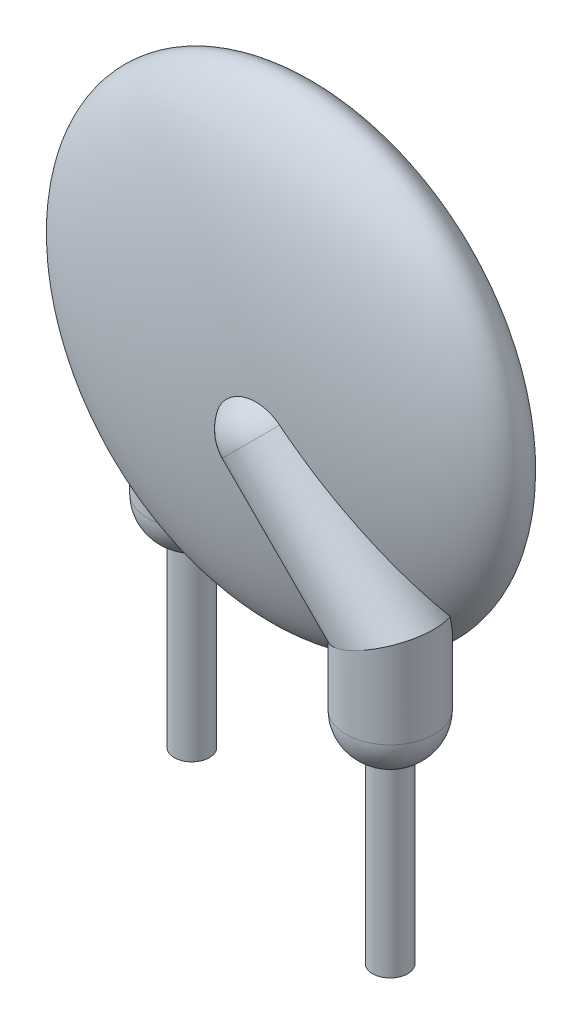
ISO-10303-21;
HEADER;
FILE_DESCRIPTION(('STEP AP214'),'2;1');
FILE_NAME('part.step','',(''),(''),'','','');
FILE_SCHEMA(('AUTOMOTIVE_DESIGN { 1 0 10303 214 1 1 1 1 }'));
ENDSEC;
DATA;
#1=APPLICATION_CONTEXT('core data for automotive mechanical design processes');
#2=APPLICATION_PROTOCOL_DEFINITION('international standard','automotive_design',2000,#1);
#3=PRODUCT_CONTEXT('',#1,'mechanical');
#4=PRODUCT('Part','Part','',(#3));
#5=PRODUCT_RELATED_PRODUCT_CATEGORY('part','',(#4));
#6=PRODUCT_DEFINITION_FORMATION('','',#4);
#7=PRODUCT_DEFINITION_CONTEXT('part definition',#1,'design');
#8=PRODUCT_DEFINITION('design','',#6,#7);
#9=PRODUCT_DEFINITION_SHAPE('','',#8);
#10=(LENGTH_UNIT() NAMED_UNIT(*) SI_UNIT(.MILLI.,.METRE.));
#11=(NAMED_UNIT(*) PLANE_ANGLE_UNIT() SI_UNIT($,.RADIAN.));
#12=(NAMED_UNIT(*) SI_UNIT($,.STERADIAN.) SOLID_ANGLE_UNIT());
#13=UNCERTAINTY_MEASURE_WITH_UNIT(LENGTH_MEASURE(1.E-05),#10,'distance_accuracy_value','');
#14=(GEOMETRIC_REPRESENTATION_CONTEXT(3) GLOBAL_UNCERTAINTY_ASSIGNED_CONTEXT((#13)) GLOBAL_UNIT_ASSIGNED_CONTEXT((#10,
#11,#12)) REPRESENTATION_CONTEXT('',''));
#15=CARTESIAN_POINT('',(0.,0.,0.));
#16=DIRECTION('',(0.,0.,1.));
#17=DIRECTION('',(1.,0.,0.));
#18=AXIS2_PLACEMENT_3D('',#15,#16,#17);
#19=CARTESIAN_POINT('',(2.44,-7.44000000000001,0.75));
#20=DIRECTION('',(0.,-1.,0.));
#21=DIRECTION('',(1.,0.,0.));
#22=AXIS2_PLACEMENT_3D('',#19,#20,#21);
#23=PLANE('',#22);
#24=CARTESIAN_POINT('',(2.44,-7.44000000000001,0.75));
#25=DIRECTION('',(0.,-1.,0.));
#26=DIRECTION('',(1.,0.,0.));
#27=AXIS2_PLACEMENT_3D('',#24,#25,#26);
#28=CIRCLE('',#27,0.3);
#29=CARTESIAN_POINT('',(2.74,-7.44000000000001,0.75));
#30=VERTEX_POINT('',#29);
#31=EDGE_CURVE('E193',#30,#30,#28,.T.);
#32=ORIENTED_EDGE('',*,*,#31,.T.);
#33=EDGE_LOOP('',(#32));
#34=FACE_BOUND('',#33,.T.);
#35=ADVANCED_FACE('F35',(#34),#23,.T.);
#36=CARTESIAN_POINT('',(2.44,-2.20330952441689,0.75));
#37=DIRECTION('',(0.,-1.,0.));
#38=DIRECTION('',(0.,0.,-1.));
#39=AXIS2_PLACEMENT_3D('',#36,#37,#38);
#40=CYLINDRICAL_SURFACE('',#39,0.3);
#41=CARTESIAN_POINT('',(2.44,-4.33585394343971,0.75));
#42=DIRECTION('',(0.,-1.,0.));
#43=DIRECTION('',(1.,0.,0.));
#44=AXIS2_PLACEMENT_3D('',#41,#42,#43);
#45=CIRCLE('',#44,0.3);
#46=CARTESIAN_POINT('',(2.74,-4.33585394343971,0.75));
#47=VERTEX_POINT('',#46);
#48=EDGE_CURVE('E195',#47,#47,#45,.F.);
#49=ORIENTED_EDGE('',*,*,#48,.F.);
#50=EDGE_LOOP('',(#49));
#51=FACE_BOUND('',#50,.T.);
#52=ORIENTED_EDGE('',*,*,#31,.F.);
#53=EDGE_LOOP('',(#52));
#54=FACE_BOUND('',#53,.T.);
#55=ADVANCED_FACE('F157',(#51,#54),#40,.T.);
#56=CARTESIAN_POINT('',(2.44,-1.99827381104221,0.75));
#57=DIRECTION('',(0.,-1.,0.));
#58=DIRECTION('',(1.,0.,0.));
#59=AXIS2_PLACEMENT_3D('',#56,#57,#58);
#60=CYLINDRICAL_SURFACE('',#59,0.75);
#61=CARTESIAN_POINT('',(3.10418976938165,-2.12002375257806,0.401643931804329));
#62=CARTESIAN_POINT('',(3.0987257976857,-2.15087015323609,0.391239018179564));
#63=CARTESIAN_POINT('',(3.09279255312696,-2.18153196072183,0.3805092808965));
#64=CARTESIAN_POINT('',(3.07977664974558,-2.24249755066909,0.358396194446954));
#65=CARTESIAN_POINT('',(3.07269003010087,-2.27279969897731,0.347010683567657));
#66=CARTESIAN_POINT('',(3.05718340473913,-2.33287333694607,0.323642347032431));
#67=CARTESIAN_POINT('',(3.04876189489372,-2.36264418533478,0.311658858150177));
#68=CARTESIAN_POINT('',(3.03039771305174,-2.42142815290459,0.287221707357246));
#69=CARTESIAN_POINT('',(3.02045878913228,-2.45044293832917,0.274769259379491));
#70=CARTESIAN_POINT('',(2.99883830153099,-2.50762541256932,0.249524770596092));
#71=CARTESIAN_POINT('',(2.98715873281078,-2.535794027348,0.23673313215809));
#72=CARTESIAN_POINT('',(2.96185820363817,-2.59116498582171,0.211029827088488));
#73=CARTESIAN_POINT('',(2.94823861021436,-2.61836799320756,0.198118250908807));
#74=CARTESIAN_POINT('',(2.91714995648035,-2.67490499214202,0.170946435290284));
#75=CARTESIAN_POINT('',(2.89941538788338,-2.70410525732029,0.156709376639755));
#76=CARTESIAN_POINT('',(2.86125359311752,-2.76110025822191,0.129032765355938));
#77=CARTESIAN_POINT('',(2.84082603387674,-2.78889481949702,0.11559331166992));
#78=CARTESIAN_POINT('',(2.79746355608369,-2.8430618409199,0.0901899741638724));
#79=CARTESIAN_POINT('',(2.77453416432202,-2.86943725094564,0.0782229573042048));
#80=CARTESIAN_POINT('',(2.72645985319182,-2.92099987968066,0.0563590004024998));
#81=CARTESIAN_POINT('',(2.70131497778452,-2.94618712195121,0.0464620192984518));
#82=CARTESIAN_POINT('',(2.64912482140116,-2.99573328620961,0.0292183475436259));
#83=CARTESIAN_POINT('',(2.6220704172847,-3.02008727235989,0.0218850581589745));
#84=CARTESIAN_POINT('',(2.56665200220072,-3.06803297590493,0.0102285470305269));
#85=CARTESIAN_POINT('',(2.53828762899044,-3.09162447934923,0.00590616326444018));
#86=CARTESIAN_POINT('',(2.48068475405711,-3.13809733154814,0.000545485834153509));
#87=CARTESIAN_POINT('',(2.45144642368398,-3.16097881774039,-0.000493447382086912));
#88=CARTESIAN_POINT('',(2.39242372809679,-3.20588224208392,0.000928632641644378));
#89=CARTESIAN_POINT('',(2.36263978178803,-3.22790480212936,0.00338706344474384));
#90=CARTESIAN_POINT('',(2.3023040382264,-3.2709809953266,0.0121093026483468));
#91=CARTESIAN_POINT('',(2.27174729782901,-3.2920177976248,0.0184234044475065));
#92=CARTESIAN_POINT('',(2.21040315230922,-3.33194469445568,0.0353000876563933));
#93=CARTESIAN_POINT('',(2.17961617556695,-3.35083804943727,0.045856102392633));
#94=CARTESIAN_POINT('',(2.1269271631424,-3.37995595994078,0.0680552538697186));
#95=CARTESIAN_POINT('',(2.10503686705952,-3.39110574332801,0.0784960172299353));
#96=CARTESIAN_POINT('',(2.06142839169527,-3.41056022531405,0.102084343960365));
#97=CARTESIAN_POINT('',(2.03970997160786,-3.41887006694259,0.115226944503209));
#98=CARTESIAN_POINT('',(2.00291845368293,-3.42956448335022,0.140240516399639));
#99=CARTESIAN_POINT('',(1.98768702741692,-3.43295655768234,0.151437563940054));
#100=CARTESIAN_POINT('',(1.95791455630337,-3.43699002594992,0.175148781050476));
#101=CARTESIAN_POINT('',(1.94337215792354,-3.43763705437771,0.187660198557492));
#102=CARTESIAN_POINT('',(1.91528514236808,-3.43573640040547,0.213768408969309));
#103=CARTESIAN_POINT('',(1.90174918001886,-3.43316379294241,0.22737289742687));
#104=CARTESIAN_POINT('',(1.87623173981068,-3.42469594233439,0.255005391238707));
#105=CARTESIAN_POINT('',(1.86425086013719,-3.41879942523109,0.269033557024046));
#106=CARTESIAN_POINT('',(1.84316047521376,-3.40478710817171,0.295531452739462));
#107=CARTESIAN_POINT('',(1.8338843030248,-3.39694763530132,0.308018398823687));
#108=CARTESIAN_POINT('',(1.81673679129764,-3.37931507902235,0.332547190498398));
#109=CARTESIAN_POINT('',(1.80886564492112,-3.3695217273876,0.344588974708272));
#110=CARTESIAN_POINT('',(1.78890654147352,-3.34044351229,0.376949025554019));
#111=CARTESIAN_POINT('',(1.77812678829637,-3.31957856861554,0.396645270055257));
#112=CARTESIAN_POINT('',(1.7594660025283,-3.27496864505986,0.43406937252195));
#113=CARTESIAN_POINT('',(1.75159662302598,-3.25121258278105,0.451789123169324));
#114=CARTESIAN_POINT('',(1.73611122004587,-3.19519398013835,0.490046437717949));
#115=CARTESIAN_POINT('',(1.72915217509633,-3.16238097873402,0.510030646545429));
#116=CARTESIAN_POINT('',(1.71753778594172,-3.09503323520867,0.547677228974179));
#117=CARTESIAN_POINT('',(1.71288697086676,-3.06049525331873,0.56533498824556));
#118=CARTESIAN_POINT('',(1.70518295129161,-2.99008540912357,0.598866780511132));
#119=CARTESIAN_POINT('',(1.70214195146338,-2.95420550458645,0.614726490238822));
#120=CARTESIAN_POINT('',(1.69725084001018,-2.8817006081301,0.644852427067493));
#121=CARTESIAN_POINT('',(1.69540112046635,-2.84507537499117,0.659118128263566));
#122=CARTESIAN_POINT('',(1.69254825112697,-2.77034040808699,0.686657893168397));
#123=CARTESIAN_POINT('',(1.69156838478216,-2.73221684588536,0.699896489813661));
#124=CARTESIAN_POINT('',(1.69030453730554,-2.65554421363589,0.72516848353905));
#125=CARTESIAN_POINT('',(1.69002089158332,-2.61699494748125,0.737201297047611));
#126=CARTESIAN_POINT('',(1.68998132960051,-2.53956464270028,0.760217331981206));
#127=CARTESIAN_POINT('',(1.69022568340351,-2.5006834444272,0.771200013279584));
#128=CARTESIAN_POINT('',(1.69110133597409,-2.42396652960932,0.7918827231554));
#129=CARTESIAN_POINT('',(1.69171955521376,-2.38613882116522,0.801613180222174));
#130=CARTESIAN_POINT('',(1.69324156867766,-2.31032095336947,0.820283327775039));
#131=CARTESIAN_POINT('',(1.69414518115972,-2.27233091253955,0.829223516889652));
#132=CARTESIAN_POINT('',(1.69616857115076,-2.19625579714937,0.846375136601593));
#133=CARTESIAN_POINT('',(1.6972880017415,-2.15817097065387,0.854587706301073));
#134=CARTESIAN_POINT('',(1.6984821791293,-2.12002375257792,0.862478092672176));
#135=B_SPLINE_CURVE_WITH_KNOTS('',3,(#61,#62,#63,#64,#65,#66,#67,#68,#69,#70,#71,#72,#73,#74,
#75,#76,#77,#78,#79,#80,#81,#82,#83,#84,#85,#86,#87,#88,#89,#90,#91,#92,#93,#94,#95,#96,#97,#98,
#99,#100,#101,#102,#103,#104,#105,#106,#107,#108,#109,#110,#111,#112,#113,#114,#115,#116,#117,
#118,#119,#120,#121,#122,#123,#124,#125,#126,#127,#128,#129,#130,#131,#132,#133,#134),
.UNSPECIFIED.,.F.,.F.,(4,2,2,2,2,2,2,2,2,2,2,2,2,2,2,2,2,2,2,2,2,2,2,2,2,2,2,2,2,2,2,2,2,2,2,2,
4),(0.,0.0990340188200194,0.19841560021576,0.297909969472655,0.397162444809596,
0.496302028953734,0.595372097328242,0.706279071787504,0.817199776228578,0.927880225855876,
1.03855847977574,1.14980692607295,1.26108632203229,1.37234404160231,1.48351965163208,
1.59617736783747,1.70866135252801,1.78853516858662,1.8682635599598,1.92567323933536,
1.98296502218557,2.04070309017124,2.09846330254752,2.15052528258134,2.20259441454607,
2.29401065625329,2.3857890628586,2.50264949299819,2.61973832499127,2.7377025832235,
2.85570564672893,2.97677957185605,3.09791181383106,3.21910602773889,3.33628753071943,
3.45339456092498,3.57031489298572),.UNSPECIFIED.);
#136=CARTESIAN_POINT('',(3.09514901851092,-2.16862839114103,0.384924989174772));
#137=VERTEX_POINT('',#136);
#138=CARTESIAN_POINT('',(1.69212270661946,-2.74978091790913,0.69361246551072));
#139=VERTEX_POINT('',#138);
#140=EDGE_CURVE('E62',#137,#139,#135,.T.);
#141=ORIENTED_EDGE('',*,*,#140,.F.);
#142=CARTESIAN_POINT('',(2.44,-2.44000000000001,0.75));
#143=DIRECTION('',(0.382683432365089,-0.923879532511287,0.));
#144=DIRECTION('',(0.923879532511287,0.382683432365089,0.));
#145=AXIS2_PLACEMENT_3D('',#142,#143,#144);
#146=ELLIPSE('',#145,0.811794150219295,0.75);
#147=EDGE_CURVE('E196',#139,#137,#146,.F.);
#148=ORIENTED_EDGE('',*,*,#147,.F.);
#149=EDGE_LOOP('',(#141,#148));
#150=FACE_BOUND('',#149,.T.);
#151=CARTESIAN_POINT('',(2.44,-3.68201910190861,0.75));
#152=DIRECTION('',(0.,-1.,0.));
#153=DIRECTION('',(1.,0.,0.));
#154=AXIS2_PLACEMENT_3D('',#151,#152,#153);
#155=CIRCLE('',#154,0.75);
#156=CARTESIAN_POINT('',(3.19,-3.68201910190861,0.75));
#157=VERTEX_POINT('',#156);
#158=EDGE_CURVE('E199',#157,#157,#155,.F.);
#159=ORIENTED_EDGE('',*,*,#158,.T.);
#160=EDGE_LOOP('',(#159));
#161=FACE_BOUND('',#160,.T.);
#162=ADVANCED_FACE('F152',(#150,#161),#60,.T.);
#163=CARTESIAN_POINT('',(0.,0.,0.75));
#164=DIRECTION('',(0.707106781186546,-0.707106781186549,0.));
#165=DIRECTION('',(0.707106781186549,0.707106781186546,0.));
#166=AXIS2_PLACEMENT_3D('',#163,#164,#165);
#167=CYLINDRICAL_SURFACE('',#166,0.75);
#168=CARTESIAN_POINT('',(0.947315596006386,-0.0426338976547848,1.14150416643228));
#169=CARTESIAN_POINT('',(1.03843675996115,-0.127911711031647,1.13467874867712));
#170=CARTESIAN_POINT('',(1.13021208307357,-0.212352307785119,1.12603067010448));
#171=CARTESIAN_POINT('',(1.31469429789944,-0.380017134487364,1.1047589707706));
#172=CARTESIAN_POINT('',(1.40740249701008,-0.463239079270765,1.09212868671045));
#173=CARTESIAN_POINT('',(1.57230475125541,-0.610146383012884,1.0658866917264));
#174=CARTESIAN_POINT('',(1.64445021168068,-0.674038916031962,1.05312603949706));
#175=CARTESIAN_POINT('',(1.78855536168963,-0.801404437504698,1.02477972969007));
#176=CARTESIAN_POINT('',(1.86051505928738,-0.864877444248092,1.00919419611968));
#177=CARTESIAN_POINT('',(2.003781687953,-0.991600575877956,0.974884288970618));
#178=CARTESIAN_POINT('',(2.07508908385494,-1.05485083587069,0.956162369988921));
#179=CARTESIAN_POINT('',(2.21654437698632,-1.18147050744546,0.915113877416108));
#180=CARTESIAN_POINT('',(2.28669250691941,-1.24483989219943,0.892788037184703));
#181=CARTESIAN_POINT('',(2.39805355756604,-1.34730425548854,0.853391149774225));
#182=CARTESIAN_POINT('',(2.43989081330203,-1.38623668164445,0.837662184180121));
#183=CARTESIAN_POINT('',(2.52254335059113,-1.4644121560979,0.804398959322729));
#184=CARTESIAN_POINT('',(2.56335874830572,-1.5036551684154,0.786864906424907));
#185=CARTESIAN_POINT('',(2.64368330099643,-1.58269617746734,0.749679220663362));
#186=CARTESIAN_POINT('',(2.68318905558396,-1.62249528750195,0.730022565604797));
#187=CARTESIAN_POINT('',(2.76021271681482,-1.70273464363436,0.688282715998212));
#188=CARTESIAN_POINT('',(2.79773140877421,-1.74317462811452,0.666200490838977));
#189=CARTESIAN_POINT('',(2.85659607511293,-1.80989077864008,0.627820581633579));
#190=CARTESIAN_POINT('',(2.87880918388199,-1.83589792183003,0.612387845723168));
#191=CARTESIAN_POINT('',(2.92173907167147,-1.8883450501889,0.580239115748127));
#192=CARTESIAN_POINT('',(2.94245632804284,-1.9147848939426,0.563523534604477));
#193=CARTESIAN_POINT('',(2.98180990271337,-1.96802278237721,0.528771309522215));
#194=CARTESIAN_POINT('',(3.00045852268203,-1.99481751566407,0.510743663528641));
#195=CARTESIAN_POINT('',(3.0351585394718,-2.04899301066795,0.473162001802005));
#196=CARTESIAN_POINT('',(3.05121248277655,-2.07637316757502,0.453609510884598));
#197=CARTESIAN_POINT('',(3.07610704650928,-2.12459760890456,0.418199543224561));
#198=CARTESIAN_POINT('',(3.08573811841122,-2.14529191393572,0.402701772873115));
#199=CARTESIAN_POINT('',(3.10262985209386,-2.18715394861693,0.37081593887337));
#200=CARTESIAN_POINT('',(3.10987689960054,-2.20832368416645,0.354423364622721));
#201=CARTESIAN_POINT('',(3.11564635162998,-2.22966981859757,0.337661799662063));
#202=B_SPLINE_CURVE_WITH_KNOTS('',3,(#168,#169,#170,#171,#172,#173,#174,#175,#176,#177,#178,
#179,#180,#181,#182,#183,#184,#185,#186,#187,#188,#189,#190,#191,#192,#193,#194,#195,#196,#197,
#198,#199,#200,#201),.UNSPECIFIED.,.F.,.F.,(4,2,2,2,2,2,2,2,2,2,2,2,2,2,2,2,4),(0.,
0.374955429079738,0.75054161902777,1.04213904152569,1.3337236665154,1.62508114868086,
1.91637941725757,2.09417466795823,2.27194961485423,2.45015480666063,2.62828903541305,
2.74081551633897,2.85330592804753,2.96508678302465,3.07675725828859,3.15941651514812,
3.2425399294333),.UNSPECIFIED.);
#203=CARTESIAN_POINT('',(0.947315596006384,-0.0426338976547853,1.14150416643228));
#204=VERTEX_POINT('',#203);
#205=EDGE_CURVE('E95',#204,#137,#202,.T.);
#206=ORIENTED_EDGE('',*,*,#205,.F.);
#207=CARTESIAN_POINT('',(0.494974746830584,-0.494974746830586,0.75));
#208=DIRECTION('',(0.707106781186548,-0.707106781186547,0.));
#209=DIRECTION('',(0.707106781186547,0.707106781186548,0.));
#210=AXIS2_PLACEMENT_3D('',#207,#208,#209);
#211=CIRCLE('',#210,0.75);
#212=CARTESIAN_POINT('',(0.0426338976547834,-0.947315596006387,1.14150416643228));
#213=VERTEX_POINT('',#212);
#214=EDGE_CURVE('E49',#204,#213,#211,.T.);
#215=ORIENTED_EDGE('',*,*,#214,.T.);
#216=CARTESIAN_POINT('',(2.22966981859755,-3.11564635162999,0.337661799662069));
#217=CARTESIAN_POINT('',(2.2102735741032,-3.11040811945341,0.352888652935625));
#218=CARTESIAN_POINT('',(2.19102254002412,-3.10394412938926,0.367815843335812));
#219=CARTESIAN_POINT('',(2.15286385138056,-3.08897626353128,0.396972201989427));
#220=CARTESIAN_POINT('',(2.13395545691793,-3.08047754268812,0.411203026465688));
#221=CARTESIAN_POINT('',(2.07817041238492,-3.05273812695384,0.452452376037104));
#222=CARTESIAN_POINT('',(2.04172673788912,-3.03109608521113,0.478428754131471));
#223=CARTESIAN_POINT('',(1.95774538735808,-2.97551550168467,0.536003935591066));
#224=CARTESIAN_POINT('',(1.9106249896838,-2.93989383422897,0.56653231814785));
#225=CARTESIAN_POINT('',(1.81769436160453,-2.86398722680938,0.623593890106662));
#226=CARTESIAN_POINT('',(1.77188652032623,-2.82369438300378,0.650120127938997));
#227=CARTESIAN_POINT('',(1.68057579357589,-2.73950259559161,0.700214640388392));
#228=CARTESIAN_POINT('',(1.63508732871924,-2.69555929186487,0.723733612340844));
#229=CARTESIAN_POINT('',(1.54483158780534,-2.60564702820114,0.767906999845413));
#230=CARTESIAN_POINT('',(1.50006377587329,-2.5596796783055,0.788563639890901));
#231=CARTESIAN_POINT('',(1.40223596847001,-2.45716584634425,0.831281808131755));
#232=CARTESIAN_POINT('',(1.3492721527358,-2.40031306052382,0.852823958213048));
#233=CARTESIAN_POINT('',(1.2436764131171,-2.28527593474989,0.892997152401496));
#234=CARTESIAN_POINT('',(1.19104456810521,-2.22709129251511,0.911627527982104));
#235=CARTESIAN_POINT('',(1.08584763180879,-2.1098183342385,0.946372612512165));
#236=CARTESIAN_POINT('',(1.03328264917101,-2.05072922307024,0.962484949631287));
#237=CARTESIAN_POINT('',(0.928085329909714,-1.93203864896554,0.992455965791329));
#238=CARTESIAN_POINT('',(0.875452988268169,-1.87243714570809,1.00631446573283));
#239=CARTESIAN_POINT('',(0.717816546397354,-1.69394123012732,1.04469609385628));
#240=CARTESIAN_POINT('',(0.612482701974307,-1.57468676578797,1.06621606463806));
#241=CARTESIAN_POINT('',(0.4000584928268,-1.33682992147989,1.10232416907179));
#242=CARTESIAN_POINT('',(0.292969165734364,-1.21822720796603,1.11691625494851));
#243=CARTESIAN_POINT('',(0.16110915501569,-1.07485617639763,1.13084221249424));
#244=CARTESIAN_POINT('',(0.137502027646913,-1.04929054750326,1.13318023989898));
#245=CARTESIAN_POINT('',(0.0901620883493238,-0.998239581475554,1.13756216033684));
#246=CARTESIAN_POINT('',(0.0664292486425728,-0.972754264257429,1.13960598528857));
#247=CARTESIAN_POINT('',(0.0426338976547798,-0.947315596006383,1.14150416643228));
#248=B_SPLINE_CURVE_WITH_KNOTS('',3,(#216,#217,#218,#219,#220,#221,#222,#223,#224,#225,#226,
#227,#228,#229,#230,#231,#232,#233,#234,#235,#236,#237,#238,#239,#240,#241,#242,#243,#244,#245,
#246,#247),.UNSPECIFIED.,.F.,.F.,(4,2,2,2,2,2,2,2,2,2,2,2,2,2,2,4),(0.,0.0755394372850866,
0.150889485147795,0.299614965350776,0.498648944690579,0.698024753852684,0.900336109898397,
1.10248934484021,1.34430056045715,1.58616721322764,1.82826033325581,2.07037268163595,
2.55186451595573,3.03308133742634,3.13770971205459,3.24236225994413),.UNSPECIFIED.);
#249=EDGE_CURVE('E56',#139,#213,#248,.T.);
#250=ORIENTED_EDGE('',*,*,#249,.F.);
#251=ORIENTED_EDGE('',*,*,#147,.T.);
#252=EDGE_LOOP('',(#206,#215,#250,#251));
#253=FACE_BOUND('',#252,.T.);
#254=ADVANCED_FACE('F147',(#253),#167,.T.);
#255=CARTESIAN_POINT('',(2.44,-3.68201910190861,0.75));
#256=DIRECTION('',(0.,-1.,0.));
#257=DIRECTION('',(1.,0.,0.));
#258=AXIS2_PLACEMENT_3D('',#255,#256,#257);
#259=DEGENERATE_TOROIDAL_SURFACE('',#258,0.05,0.7,.T.);
#260=ORIENTED_EDGE('',*,*,#158,.F.);
#261=EDGE_LOOP('',(#260));
#262=FACE_BOUND('',#261,.T.);
#263=ORIENTED_EDGE('',*,*,#48,.T.);
#264=EDGE_LOOP('',(#263));
#265=FACE_BOUND('',#264,.T.);
#266=ADVANCED_FACE('F151',(#262,#265),#259,.T.);
#267=CARTESIAN_POINT('',(0.494974746830583,-0.494974746830584,0.75));
#268=DIRECTION('',(0.707106781186548,-0.707106781186547,0.));
#269=DIRECTION('',(0.707106781186547,0.707106781186548,0.));
#270=AXIS2_PLACEMENT_3D('',#267,#268,#269);
#271=DEGENERATE_TOROIDAL_SURFACE('',#270,0.05,0.7,.T.);
#272=CARTESIAN_POINT('',(0.0426338976547833,-0.947315596006386,1.14150416643228));
#273=CARTESIAN_POINT('',(0.0195583795690925,-0.922691584134689,1.14334331544036));
#274=CARTESIAN_POINT('',(-0.00136943553259904,-0.896075010486037,1.14518183013688));
#275=CARTESIAN_POINT('',(-0.0384328939593029,-0.839732372762315,1.14880422091724));
#276=CARTESIAN_POINT('',(-0.0545742517248633,-0.810010074368649,1.15058815985609));
#277=CARTESIAN_POINT('',(-0.081629907084066,-0.74825876009682,1.15405323282589));
#278=CARTESIAN_POINT('',(-0.09254254579076,-0.716229015850672,1.15573433408272));
#279=CARTESIAN_POINT('',(-0.108865472963188,-0.650796090675425,1.15894627516708));
#280=CARTESIAN_POINT('',(-0.114276278904009,-0.617393039220315,1.16047712911388));
#281=CARTESIAN_POINT('',(-0.119512260356788,-0.549953142268816,1.16335544646869));
#282=CARTESIAN_POINT('',(-0.119305153120736,-0.515913757442989,1.16470180524844));
#283=CARTESIAN_POINT('',(-0.11331379915116,-0.448319134244734,1.16716524375684));
#284=CARTESIAN_POINT('',(-0.107528176876439,-0.414764017353576,1.16828226685386));
#285=CARTESIAN_POINT('',(-0.0904465511546158,-0.348229272638298,1.17028227363976));
#286=CARTESIAN_POINT('',(-0.0790223874895763,-0.315282469032624,1.17115903852992));
#287=CARTESIAN_POINT('',(-0.0510745494353313,-0.251624011525386,1.17262160503568));
#288=CARTESIAN_POINT('',(-0.0345493756999753,-0.220913018082605,1.17320732097062));
#289=CARTESIAN_POINT('',(0.00400029449904651,-0.160865170982973,1.17409809716511));
#290=CARTESIAN_POINT('',(0.0262667146633576,-0.131683593488117,1.17438692140223));
#291=CARTESIAN_POINT('',(0.0751134914758824,-0.0771723184308821,1.17462332303993));
#292=CARTESIAN_POINT('',(0.101695878265694,-0.0518444444848255,1.17457073939323));
#293=CARTESIAN_POINT('',(0.160225743574147,-0.0043330620026205,1.17411152829343));
#294=CARTESIAN_POINT('',(0.192397834616704,0.0175750891089012,1.17368410049468));
#295=CARTESIAN_POINT('',(0.260053248026536,0.0554755179529537,1.17245637330771));
#296=CARTESIAN_POINT('',(0.295535512154272,0.0714696782865344,1.17165619276151));
#297=CARTESIAN_POINT('',(0.36763908254833,0.0963954645008271,1.16973626486272));
#298=CARTESIAN_POINT('',(0.404188442218392,0.105535227101428,1.1686274718806));
#299=CARTESIAN_POINT('',(0.478321160071799,0.117095753966331,1.16611431203863));
#300=CARTESIAN_POINT('',(0.515904050224114,0.119519510552986,1.16471007711335));
#301=CARTESIAN_POINT('',(0.588511350147873,0.117514425593328,1.16174703132923));
#302=CARTESIAN_POINT('',(0.623548227527968,0.113506319996443,1.16020346347559));
#303=CARTESIAN_POINT('',(0.692387887294386,0.099475458862654,1.1569413527722));
#304=CARTESIAN_POINT('',(0.726190585651469,0.0894522945967843,1.15522279803851));
#305=CARTESIAN_POINT('',(0.793599635684681,0.062817313484149,1.15154820836445));
#306=CARTESIAN_POINT('',(0.82705966110193,0.0458304403959971,1.14958403408943));
#307=CARTESIAN_POINT('',(0.874427961681454,0.0159013860203632,1.14658443691571));
#308=CARTESIAN_POINT('',(0.889770476497827,0.00516178932984755,1.14557394051685));
#309=CARTESIAN_POINT('',(0.919378956931359,-0.017712051810241,1.14354388894875));
#310=CARTESIAN_POINT('',(0.933644854968969,-0.029846383687329,1.14252433321534));
#311=CARTESIAN_POINT('',(0.947315596006382,-0.0426338976547842,1.14150416643227));
#312=B_SPLINE_CURVE_WITH_KNOTS('',3,(#272,#273,#274,#275,#276,#277,#278,#279,#280,#281,#282,
#283,#284,#285,#286,#287,#288,#289,#290,#291,#292,#293,#294,#295,#296,#297,#298,#299,#300,#301,
#302,#303,#304,#305,#306,#307,#308,#309,#310,#311),.UNSPECIFIED.,.F.,.F.,(4,2,2,2,2,2,2,2,2,2,2,
2,2,2,2,2,2,2,2,4),(0.,0.101247705376281,0.202374042244985,0.303532441701129,0.404681325819881,
0.506411573857636,0.608166912791664,0.712349672909585,0.816563084800414,0.926213330992716,
1.03591530462252,1.15211959558951,1.26828686332599,1.38076535224432,1.49319371820908,
1.5985624121604,1.70393826682568,1.81594791491886,1.87214172235695,1.92833905416801),.UNSPECIFIED.);
#313=EDGE_CURVE('E11',#213,#204,#312,.T.);
#314=ORIENTED_EDGE('',*,*,#313,.F.);
#315=ORIENTED_EDGE('',*,*,#214,.F.);
#316=EDGE_LOOP('',(#314,#315));
#317=FACE_BOUND('',#316,.T.);
#318=ADVANCED_FACE('F37',(#317),#271,.T.);
#319=CARTESIAN_POINT('',(0.,0.,0.));
#320=DIRECTION('',(1.,0.,0.));
#321=DIRECTION('',(0.,1.,0.));
#322=AXIS2_PLACEMENT_3D('',#319,#320,#321);
#323=ELLIPSE('',#322,4.,1.175);
#324=TRIMMED_CURVE('',#323,(PARAMETER_VALUE(4.71238898038469)),
(PARAMETER_VALUE(7.85398163397448)),.T.,.PARAMETER.);
#325=CARTESIAN_POINT('',(0.,0.,-1.77164159654439));
#326=DIRECTION('',(0.,0.,-1.));
#327=AXIS1_PLACEMENT('',#325,#326);
#328=SURFACE_OF_REVOLUTION('',#324,#327);
#329=CARTESIAN_POINT('',(0.,0.,-1.175));
#330=VERTEX_POINT('',#329);
#331=VERTEX_LOOP('',#330);
#332=FACE_BOUND('',#331,.T.);
#333=CARTESIAN_POINT('',(0.,0.,1.175));
#334=VERTEX_POINT('',#333);
#335=VERTEX_LOOP('',#334);
#336=FACE_BOUND('',#335,.T.);
#337=ORIENTED_EDGE('',*,*,#205,.T.);
#338=ORIENTED_EDGE('',*,*,#140,.T.);
#339=ORIENTED_EDGE('',*,*,#249,.T.);
#340=ORIENTED_EDGE('',*,*,#313,.T.);
#341=EDGE_LOOP('',(#337,#338,#339,#340));
#342=FACE_BOUND('',#341,.T.);
#343=CARTESIAN_POINT('',(-1.6984821791293,-2.12002375257805,-0.862478092672149));
#344=CARTESIAN_POINT('',(-1.69715737027736,-2.16237818378098,-0.853716320166754));
#345=CARTESIAN_POINT('',(-1.69592318692744,-2.20465663527329,-0.844558789976077));
#346=CARTESIAN_POINT('',(-1.69372860673778,-2.28913096431526,-0.825330096508913));
#347=CARTESIAN_POINT('',(-1.69276895108272,-2.33132631847905,-0.815256554870648));
#348=CARTESIAN_POINT('',(-1.69122323584686,-2.41552247913011,-0.794108076359689));
#349=CARTESIAN_POINT('',(-1.6906375831476,-2.45752302455497,-0.783032063788833));
#350=CARTESIAN_POINT('',(-1.68995795700246,-2.54309769994526,-0.759235814774788));
#351=CARTESIAN_POINT('',(-1.68988724034954,-2.58665781149689,-0.746464082374633));
#352=CARTESIAN_POINT('',(-1.6904985611486,-2.67329926391495,-0.719517458320901));
#353=CARTESIAN_POINT('',(-1.69117995828609,-2.71638098054635,-0.70534376957343));
#354=CARTESIAN_POINT('',(-1.69357289174457,-2.80190800459444,-0.675341691970244));
#355=CARTESIAN_POINT('',(-1.69528362896437,-2.84435377953685,-0.659514594563365));
#356=CARTESIAN_POINT('',(-1.69952468488231,-2.91753383486008,-0.6301873093549));
#357=CARTESIAN_POINT('',(-1.70173011285353,-2.94846692103476,-0.617138802817619));
#358=CARTESIAN_POINT('',(-1.70719080284737,-3.00968651748506,-0.589729266693307));
#359=CARTESIAN_POINT('',(-1.71044678011823,-3.03997257221923,-0.575367347679493));
#360=CARTESIAN_POINT('',(-1.71832266014819,-3.0992684972279,-0.545251732614857));
#361=CARTESIAN_POINT('',(-1.72292786114858,-3.1282884380352,-0.52951425912812));
#362=CARTESIAN_POINT('',(-1.73401713436294,-3.1848800562796,-0.496234278458676));
#363=CARTESIAN_POINT('',(-1.74049823665114,-3.21245394222783,-0.478694652537397));
#364=CARTESIAN_POINT('',(-1.75372844169101,-3.25726240582943,-0.447135283549442));
#365=CARTESIAN_POINT('',(-1.75979311542344,-3.27508574280923,-0.433673233161948));
#366=CARTESIAN_POINT('',(-1.77357416297956,-3.30918295268876,-0.405584521646585));
#367=CARTESIAN_POINT('',(-1.78129282002525,-3.32545463830025,-0.390956268356594));
#368=CARTESIAN_POINT('',(-1.79891208224302,-3.35590063437359,-0.360356374078681));
#369=CARTESIAN_POINT('',(-1.80883948427744,-3.37004526443815,-0.344369869748621));
#370=CARTESIAN_POINT('',(-1.83120996441384,-3.39490684540222,-0.311519560059774));
#371=CARTESIAN_POINT('',(-1.84364503935646,-3.4056344275974,-0.294658669343628));
#372=CARTESIAN_POINT('',(-1.86765241606712,-3.42049823422031,-0.265041274026042));
#373=CARTESIAN_POINT('',(-1.87865778521278,-3.42561305595633,-0.252316875406546));
#374=CARTESIAN_POINT('',(-1.90194262316305,-3.43310273429016,-0.227231980087868));
#375=CARTESIAN_POINT('',(-1.91422172592722,-3.43547837569809,-0.214871380145274));
#376=CARTESIAN_POINT('',(-1.93968545727745,-3.43754147584508,-0.190992644289684));
#377=CARTESIAN_POINT('',(-1.95286668685304,-3.43723852743876,-0.179471650884546));
#378=CARTESIAN_POINT('',(-1.97985018032907,-3.43428821545042,-0.157491518234325));
#379=CARTESIAN_POINT('',(-1.99365346269881,-3.43163686396543,-0.147034218974658));
#380=CARTESIAN_POINT('',(-2.02915356566655,-3.42246342681439,-0.121988487699993));
#381=CARTESIAN_POINT('',(-2.05108475846011,-3.41462383431204,-0.108221758828198));
#382=CARTESIAN_POINT('',(-2.09519849512,-3.39584402832973,-0.0834740861009333));
#383=CARTESIAN_POINT('',(-2.11738160375785,-3.38489437445913,-0.072501820003395));
#384=CARTESIAN_POINT('',(-2.15810400659522,-3.36290248212612,-0.0546987569857977));
#385=CARTESIAN_POINT('',(-2.1766467064955,-3.35216743201783,-0.0474842427983942));
#386=CARTESIAN_POINT('',(-2.21367180913127,-3.32966133732958,-0.0346962891370518));
#387=CARTESIAN_POINT('',(-2.23215417253532,-3.31788971911901,-0.0291237658386452));
#388=CARTESIAN_POINT('',(-2.28751763812501,-3.28143913115169,-0.0146722462551247));
#389=CARTESIAN_POINT('',(-2.32427716817332,-3.25564617195102,-0.00807531246850249));
#390=CARTESIAN_POINT('',(-2.38698195610527,-3.20989255309902,-0.00141073040332013));
#391=CARTESIAN_POINT('',(-2.41308816352526,-3.19030786944729,-3.64456690724162E-05));
#392=CARTESIAN_POINT('',(-2.46483630034217,-3.1505006696614,3.50096614122894E-05));
#393=CARTESIAN_POINT('',(-2.49047805651202,-3.13027792295656,-0.00126879866556523));
#394=CARTESIAN_POINT('',(-2.54103716080186,-3.08930184736089,-0.00640310746448756));
#395=CARTESIAN_POINT('',(-2.5659550318664,-3.06854892292939,-0.0102317340664462));
#396=CARTESIAN_POINT('',(-2.61480890884274,-3.02644336629973,-0.0202305656151249));
#397=CARTESIAN_POINT('',(-2.63874456562711,-3.00509052532788,-0.0264015953141145));
#398=CARTESIAN_POINT('',(-2.68564915734035,-2.96133884362638,-0.0409385190384217));
#399=CARTESIAN_POINT('',(-2.70859807781913,-2.93892908662117,-0.0493361001523848));
#400=CARTESIAN_POINT('',(-2.75280352974405,-2.89320154249632,-0.0679230814413981));
#401=CARTESIAN_POINT('',(-2.77406002008966,-2.86988373334517,-0.0781125251124168));
#402=CARTESIAN_POINT('',(-2.81459159804927,-2.82221515458516,-0.0998387299350551));
#403=CARTESIAN_POINT('',(-2.8338682830842,-2.79786524051026,-0.111374388569048));
#404=CARTESIAN_POINT('',(-2.87029804139934,-2.74804742885644,-0.135330007139844));
#405=CARTESIAN_POINT('',(-2.88745134487021,-2.72257965286842,-0.147749870991768));
#406=CARTESIAN_POINT('',(-2.92548119760632,-2.6610160817078,-0.177646815719728));
#407=CARTESIAN_POINT('',(-2.94542886705177,-2.62443637225441,-0.195313952155997));
#408=CARTESIAN_POINT('',(-2.98158043341133,-2.54942116936522,-0.230548474324015));
#409=CARTESIAN_POINT('',(-2.99778233740088,-2.51098470113252,-0.248115802126939));
#410=CARTESIAN_POINT('',(-3.02698000683133,-2.43251091659075,-0.282596222389388));
#411=CARTESIAN_POINT('',(-3.03996724240773,-2.39246966201001,-0.299507475952798));
#412=CARTESIAN_POINT('',(-3.06324286865256,-2.31122348247109,-0.332300711069462));
#413=CARTESIAN_POINT('',(-3.07353202031334,-2.27001888927128,-0.348182981892831));
#414=CARTESIAN_POINT('',(-3.086693761443,-2.21043523923175,-0.370071261699043));
#415=CARTESIAN_POINT('',(-3.09045350701264,-2.19241809438125,-0.376551668925591));
#416=CARTESIAN_POINT('',(-3.09759280227855,-2.15629715533871,-0.389272021403873));
#417=CARTESIAN_POINT('',(-3.10097363099908,-2.1381938817648,-0.395512725796603));
#418=CARTESIAN_POINT('',(-3.10418976938064,-2.12002375257779,-0.401643931805045));
#419=B_SPLINE_CURVE_WITH_KNOTS('',3,(#343,#344,#345,#346,#347,#348,#349,#350,#351,#352,#353,
#354,#355,#356,#357,#358,#359,#360,#361,#362,#363,#364,#365,#366,#367,#368,#369,#370,#371,#372,
#373,#374,#375,#376,#377,#378,#379,#380,#381,#382,#383,#384,#385,#386,#387,#388,#389,#390,#391,
#392,#393,#394,#395,#396,#397,#398,#399,#400,#401,#402,#403,#404,#405,#406,#407,#408,#409,#410,
#411,#412,#413,#414,#415,#416,#417,#418),.UNSPECIFIED.,.F.,.F.,(4,2,2,2,2,2,2,2,2,2,2,2,2,2,2,2,
2,2,2,2,2,2,2,2,2,2,2,2,2,2,2,2,2,2,2,2,2,4),(0.,0.129816986212266,0.2599812210203,
0.390286822643244,0.526443077016045,0.662483503669426,0.798418454919981,0.8993169181479,
1.00028422181146,1.10018984833182,1.19993816149038,1.26926833537975,1.3386948390446,
1.40901464072979,1.47911347304381,1.5316166315229,1.58410474343623,1.63640495561477,
1.68879415119448,1.76949665663862,1.85044679640837,1.91817609987645,1.98594312276009,
2.12161539865136,2.21950753291061,2.31743545604413,2.41529078069169,2.5131805918786,
2.61254618505098,2.71191419057327,2.81120137977304,2.91047779604536,3.04601960020626,
3.18163335391279,3.31760318064756,3.45353461585455,3.51206912211838,3.57039968447666),.UNSPECIFIED.);
#420=CARTESIAN_POINT('',(-1.69212270661949,-2.74978091790914,-0.69361246551071));
#421=VERTEX_POINT('',#420);
#422=CARTESIAN_POINT('',(-3.09514901851651,-2.16862839115504,-0.384924989164079));
#423=VERTEX_POINT('',#422);
#424=EDGE_CURVE('E99',#421,#423,#419,.T.);
#425=ORIENTED_EDGE('',*,*,#424,.F.);
#426=CARTESIAN_POINT('',(-0.0426338976547829,-0.947315596006383,-1.14150416643228));
#427=CARTESIAN_POINT('',(-0.127911711031646,-1.03843675996115,-1.13467874867712));
#428=CARTESIAN_POINT('',(-0.212352307785117,-1.13021208307357,-1.12603067010448));
#429=CARTESIAN_POINT('',(-0.380017134487361,-1.31469429789944,-1.1047589707706));
#430=CARTESIAN_POINT('',(-0.463239079270761,-1.40740249701008,-1.09212868671045));
#431=CARTESIAN_POINT('',(-0.61014638301288,-1.57230475125541,-1.0658866917264));
#432=CARTESIAN_POINT('',(-0.674038916031958,-1.64445021168068,-1.05312603949706));
#433=CARTESIAN_POINT('',(-0.801404437504695,-1.78855536168963,-1.02477972969007));
#434=CARTESIAN_POINT('',(-0.864877444248088,-1.86051505928738,-1.00919419611968));
#435=CARTESIAN_POINT('',(-0.991600575877953,-2.003781687953,-0.974884288970619));
#436=CARTESIAN_POINT('',(-1.05485083587069,-2.07508908385494,-0.956162369988921));
#437=CARTESIAN_POINT('',(-1.18147050744546,-2.21654437698632,-0.915113877416108));
#438=CARTESIAN_POINT('',(-1.24483989219942,-2.28669250691942,-0.892788037184703));
#439=CARTESIAN_POINT('',(-1.34730425548854,-2.39805355756605,-0.853391149774225));
#440=CARTESIAN_POINT('',(-1.38623668164444,-2.43989081330204,-0.837662184180121));
#441=CARTESIAN_POINT('',(-1.4644121560979,-2.52254335059114,-0.804398959322728));
#442=CARTESIAN_POINT('',(-1.5036551684154,-2.56335874830572,-0.786864906424905));
#443=CARTESIAN_POINT('',(-1.58269617746734,-2.64368330099643,-0.74967922066336));
#444=CARTESIAN_POINT('',(-1.62249528750195,-2.68318905558397,-0.730022565604794));
#445=CARTESIAN_POINT('',(-1.70273464363437,-2.76021271681483,-0.688282715998208));
#446=CARTESIAN_POINT('',(-1.74317462811453,-2.79773140877422,-0.666200490838972));
#447=CARTESIAN_POINT('',(-1.80989077864008,-2.85659607511294,-0.627820581633574));
#448=CARTESIAN_POINT('',(-1.83589792183004,-2.878809183882,-0.612387845723163));
#449=CARTESIAN_POINT('',(-1.8883450501889,-2.92173907167148,-0.580239115748121));
#450=CARTESIAN_POINT('',(-1.9147848939426,-2.94245632804285,-0.56352353460447));
#451=CARTESIAN_POINT('',(-1.96802278237722,-2.98180990271338,-0.528771309522207));
#452=CARTESIAN_POINT('',(-1.99481751566408,-3.00045852268204,-0.510743663528634));
#453=CARTESIAN_POINT('',(-2.04899301066796,-3.03515853947181,-0.473162001801997));
#454=CARTESIAN_POINT('',(-2.07637316757503,-3.05121248277656,-0.45360951088459));
#455=CARTESIAN_POINT('',(-2.12459760890457,-3.07610704650929,-0.418199543224556));
#456=CARTESIAN_POINT('',(-2.14529191393572,-3.08573811841123,-0.402701772873113));
#457=CARTESIAN_POINT('',(-2.18715394861692,-3.10262985209386,-0.370815938873374));
#458=CARTESIAN_POINT('',(-2.20832368416643,-3.10987689960054,-0.354423364622729));
#459=CARTESIAN_POINT('',(-2.22966981859755,-3.11564635162998,-0.337661799662074));
#460=B_SPLINE_CURVE_WITH_KNOTS('',3,(#426,#427,#428,#429,#430,#431,#432,#433,#434,#435,#436,
#437,#438,#439,#440,#441,#442,#443,#444,#445,#446,#447,#448,#449,#450,#451,#452,#453,#454,#455,
#456,#457,#458,#459),.UNSPECIFIED.,.F.,.F.,(4,2,2,2,2,2,2,2,2,2,2,2,2,2,2,2,4),(0.,
0.374955429079739,0.750541619027771,1.0421390415257,1.3337236665154,1.62508114868086,
1.91637941725757,2.09417466795823,2.27194961485424,2.45015480666064,2.62828903541306,
2.74081551633899,2.85330592804755,2.96508678302467,3.07675725828861,3.15941651514812,
3.24253992943328),.UNSPECIFIED.);
#461=CARTESIAN_POINT('',(-0.0426338976547826,-0.947315596006384,-1.14150416643228));
#462=VERTEX_POINT('',#461);
#463=EDGE_CURVE('E101',#462,#421,#460,.T.);
#464=ORIENTED_EDGE('',*,*,#463,.F.);
#465=CARTESIAN_POINT('',(-0.0426338976547827,-0.947315596006385,-1.14150416643228));
#466=CARTESIAN_POINT('',(-0.0195583795690935,-0.922691584134686,-1.14334331544036));
#467=CARTESIAN_POINT('',(0.00136943553259824,-0.896075010486035,-1.14518183013688));
#468=CARTESIAN_POINT('',(0.038432893959303,-0.839732372762313,-1.14880422091724));
#469=CARTESIAN_POINT('',(0.0545742517248643,-0.810010074368648,-1.15058815985609));
#470=CARTESIAN_POINT('',(0.0816299070840665,-0.748258760096819,-1.15405323282589));
#471=CARTESIAN_POINT('',(0.0925425457907592,-0.716229015850671,-1.15573433408272));
#472=CARTESIAN_POINT('',(0.108865472963186,-0.650796090675423,-1.15894627516708));
#473=CARTESIAN_POINT('',(0.114276278904009,-0.617393039220314,-1.16047712911388));
#474=CARTESIAN_POINT('',(0.119512260356788,-0.549953142268815,-1.16335544646869));
#475=CARTESIAN_POINT('',(0.119305153120736,-0.515913757442988,-1.16470180524844));
#476=CARTESIAN_POINT('',(0.113313799151159,-0.448319134244733,-1.16716524375683));
#477=CARTESIAN_POINT('',(0.107528176876438,-0.414764017353575,-1.16828226685386));
#478=CARTESIAN_POINT('',(0.0904465511546148,-0.348229272638297,-1.17028227363976));
#479=CARTESIAN_POINT('',(0.0790223874895755,-0.315282469032623,-1.17115903852992));
#480=CARTESIAN_POINT('',(0.0510745494353303,-0.251624011525385,-1.17262160503568));
#481=CARTESIAN_POINT('',(0.0345493756999739,-0.220913018082605,-1.17320732097062));
#482=CARTESIAN_POINT('',(-0.00400029449904781,-0.160865170982972,-1.17409809716511));
#483=CARTESIAN_POINT('',(-0.0262667146633583,-0.131683593488115,-1.17438692140223));
#484=CARTESIAN_POINT('',(-0.0751134914758841,-0.0771723184308805,-1.17462332303993));
#485=CARTESIAN_POINT('',(-0.101695878265697,-0.0518444444848249,-1.17457073939323));
#486=CARTESIAN_POINT('',(-0.160225743574151,-0.00433306200262011,-1.17411152829343));
#487=CARTESIAN_POINT('',(-0.192397834616707,0.0175750891089026,-1.17368410049468));
#488=CARTESIAN_POINT('',(-0.260053248026538,0.0554755179529557,-1.17245637330771));
#489=CARTESIAN_POINT('',(-0.295535512154274,0.0714696782865359,-1.17165619276151));
#490=CARTESIAN_POINT('',(-0.367639082548332,0.0963954645008282,-1.16973626486272));
#491=CARTESIAN_POINT('',(-0.404188442218394,0.10553522710143,-1.1686274718806));
#492=CARTESIAN_POINT('',(-0.478321160071802,0.117095753966333,-1.16611431203863));
#493=CARTESIAN_POINT('',(-0.515904050224117,0.119519510552988,-1.16471007711335));
#494=CARTESIAN_POINT('',(-0.588511350147875,0.117514425593329,-1.16174703132923));
#495=CARTESIAN_POINT('',(-0.62354822752797,0.113506319996444,-1.16020346347559));
#496=CARTESIAN_POINT('',(-0.692387887294388,0.0994754588626546,-1.1569413527722));
#497=CARTESIAN_POINT('',(-0.726190585651471,0.0894522945967855,-1.15522279803851));
#498=CARTESIAN_POINT('',(-0.793599635684684,0.0628173134841502,-1.15154820836445));
#499=CARTESIAN_POINT('',(-0.827059661101932,0.0458304403959978,-1.14958403408943));
#500=CARTESIAN_POINT('',(-0.874427961681456,0.0159013860203633,-1.14658443691571));
#501=CARTESIAN_POINT('',(-0.889770476497828,0.00516178932984744,-1.14557394051685));
#502=CARTESIAN_POINT('',(-0.919378956931361,-0.0177120518102408,-1.14354388894875));
#503=CARTESIAN_POINT('',(-0.933644854968971,-0.0298463836873284,-1.14252433321534));
#504=CARTESIAN_POINT('',(-0.947315596006386,-0.0426338976547824,-1.14150416643228));
#505=B_SPLINE_CURVE_WITH_KNOTS('',3,(#465,#466,#467,#468,#469,#470,#471,#472,#473,#474,#475,
#476,#477,#478,#479,#480,#481,#482,#483,#484,#485,#486,#487,#488,#489,#490,#491,#492,#493,#494,
#495,#496,#497,#498,#499,#500,#501,#502,#503,#504),.UNSPECIFIED.,.F.,.F.,(4,2,2,2,2,2,2,2,2,2,2,
2,2,2,2,2,2,2,2,4),(0.,0.101247705376281,0.202374042244984,0.303532441701128,0.404681325819879,
0.506411573857634,0.608166912791662,0.712349672909584,0.816563084800412,0.926213330992716,
1.03591530462252,1.15211959558951,1.26828686332599,1.38076535224432,1.49319371820908,
1.5985624121604,1.70393826682568,1.81594791491886,1.87214172235695,1.92833905416801),.UNSPECIFIED.);
#506=CARTESIAN_POINT('',(-0.947315596006385,-0.0426338976547828,-1.14150416643228));
#507=VERTEX_POINT('',#506);
#508=EDGE_CURVE('E164',#462,#507,#505,.T.);
#509=ORIENTED_EDGE('',*,*,#508,.T.);
#510=CARTESIAN_POINT('',(-3.11564635162998,-2.22966981859756,-0.33766179966207));
#511=CARTESIAN_POINT('',(-3.11040806858528,-2.2102733865717,-0.352888800401286));
#512=CARTESIAN_POINT('',(-3.10394400434573,-2.19102216800639,-0.367816131960803));
#513=CARTESIAN_POINT('',(-3.08897595485935,-2.15286311775879,-0.396972758299074));
#514=CARTESIAN_POINT('',(-3.08047712476095,-2.13395454614808,-0.411203709369192));
#515=CARTESIAN_POINT('',(-3.0527373487979,-2.07816898676501,-0.452453411545893));
#516=CARTESIAN_POINT('',(-3.03109502059046,-2.04172498266549,-0.478429995220826));
#517=CARTESIAN_POINT('',(-2.97551378506239,-1.95774299062105,-0.536005527939305));
#518=CARTESIAN_POINT('',(-2.93989175091909,-1.91062228320541,-0.566534048989481));
#519=CARTESIAN_POINT('',(-2.86398439110396,-1.81769104483883,-0.623595857399378));
#520=CARTESIAN_POINT('',(-2.82369116157176,-1.7718829030271,-0.65012219313104));
#521=CARTESIAN_POINT('',(-2.73949858770213,-1.68057157184218,-0.700216874646614));
#522=CARTESIAN_POINT('',(-2.69555488295971,-1.6350828032008,-0.723735917123101));
#523=CARTESIAN_POINT('',(-2.60564181618399,-1.54482645515607,-0.767909422116225));
#524=CARTESIAN_POINT('',(-2.5596740641937,-1.50005833987758,-0.78856610914536));
#525=CARTESIAN_POINT('',(-2.45715974973563,-1.40223024459934,-0.831284193204342));
#526=CARTESIAN_POINT('',(-2.40030689838134,-1.34926643932059,-0.852826232613228));
#527=CARTESIAN_POINT('',(-2.28526966175919,-1.24367071169082,-0.89299922076138));
#528=CARTESIAN_POINT('',(-2.22708497422152,-1.19103886820848,-0.911629500992895));
#529=CARTESIAN_POINT('',(-2.10981194030829,-1.08584192851535,-0.946374405724801));
#530=CARTESIAN_POINT('',(-2.05072279883196,-1.03327694094286,-0.962486658442452));
#531=CARTESIAN_POINT('',(-1.93203217479773,-0.928079605879448,-0.992457514171287));
#532=CARTESIAN_POINT('',(-1.87243065192028,-0.875447253370111,-1.0063159380865));
#533=CARTESIAN_POINT('',(-1.69393469536297,-0.717810776029252,-1.04469734712006));
#534=CARTESIAN_POINT('',(-1.57468022206321,-0.612476899575269,-1.06621718432545));
#535=CARTESIAN_POINT('',(-1.33682338190897,-0.40005261064594,-1.10232503589304));
#536=CARTESIAN_POINT('',(-1.21822068150048,-0.292963235798078,-1.11691700242209));
#537=CARTESIAN_POINT('',(-1.07485076251873,-0.161104159876433,-1.13084271375868));
#538=CARTESIAN_POINT('',(-1.04928622137041,-0.137498024497689,-1.13318062337296));
#539=CARTESIAN_POINT('',(-0.998237423879915,-0.0901600791370211,-1.13756233335508));
#540=CARTESIAN_POINT('',(-0.972753187452307,-0.0664282413781416,-1.1396060656441));
#541=CARTESIAN_POINT('',(-0.947315596006386,-0.0426338976547806,-1.14150416643228));
#542=B_SPLINE_CURVE_WITH_KNOTS('',3,(#510,#511,#512,#513,#514,#515,#516,#517,#518,#519,#520,
#521,#522,#523,#524,#525,#526,#527,#528,#529,#530,#531,#532,#533,#534,#535,#536,#537,#538,#539,
#540,#541),.UNSPECIFIED.,.F.,.F.,(4,2,2,2,2,2,2,2,2,2,2,2,2,2,2,4),(0.,0.0755401662657649,
0.150890937314218,0.299617830790326,0.498653245991561,0.698030492914988,0.900343320048179,
1.10249802487373,1.34430927132883,1.5861759536795,1.8282690997782,2.07038147393235,
2.55187333856356,3.033090193799,3.13771413844547,3.24236225648189),.UNSPECIFIED.);
#543=EDGE_CURVE('E103',#423,#507,#542,.T.);
#544=ORIENTED_EDGE('',*,*,#543,.F.);
#545=EDGE_LOOP('',(#425,#464,#509,#544));
#546=FACE_BOUND('',#545,.T.);
#547=ADVANCED_FACE('F87',(#332,#336,#342,#546),#328,.F.);
#548=CARTESIAN_POINT('',(-2.44,-7.44000000000001,-0.75));
#549=DIRECTION('',(0.,-1.,0.));
#550=DIRECTION('',(1.,0.,0.));
#551=AXIS2_PLACEMENT_3D('',#548,#549,#550);
#552=PLANE('',#551);
#553=CARTESIAN_POINT('',(-2.44,-7.44000000000001,-0.75));
#554=DIRECTION('',(0.,-1.,0.));
#555=DIRECTION('',(1.,0.,0.));
#556=AXIS2_PLACEMENT_3D('',#553,#554,#555);
#557=CIRCLE('',#556,0.3);
#558=CARTESIAN_POINT('',(-2.14,-7.44000000000001,-0.75));
#559=VERTEX_POINT('',#558);
#560=EDGE_CURVE('E107',#559,#559,#557,.T.);
#561=ORIENTED_EDGE('',*,*,#560,.T.);
#562=EDGE_LOOP('',(#561));
#563=FACE_BOUND('',#562,.T.);
#564=ADVANCED_FACE('F90',(#563),#552,.T.);
#565=CARTESIAN_POINT('',(-2.44,-2.20330952441688,-0.75));
#566=DIRECTION('',(0.,-1.,0.));
#567=DIRECTION('',(1.,0.,0.));
#568=AXIS2_PLACEMENT_3D('',#565,#566,#567);
#569=CYLINDRICAL_SURFACE('',#568,0.3);
#570=ORIENTED_EDGE('',*,*,#560,.F.);
#571=EDGE_LOOP('',(#570));
#572=FACE_BOUND('',#571,.T.);
#573=CARTESIAN_POINT('',(-2.44,-4.33585394343972,-0.75));
#574=DIRECTION('',(0.,1.,0.));
#575=DIRECTION('',(-1.,0.,0.));
#576=AXIS2_PLACEMENT_3D('',#573,#574,#575);
#577=CIRCLE('',#576,0.3);
#578=CARTESIAN_POINT('',(-2.74,-4.33585394343972,-0.75));
#579=VERTEX_POINT('',#578);
#580=EDGE_CURVE('E110',#579,#579,#577,.T.);
#581=ORIENTED_EDGE('',*,*,#580,.F.);
#582=EDGE_LOOP('',(#581));
#583=FACE_BOUND('',#582,.T.);
#584=ADVANCED_FACE('F131',(#572,#583),#569,.T.);
#585=CARTESIAN_POINT('',(-2.44,-3.68201910190861,-0.75));
#586=DIRECTION('',(0.,-1.,0.));
#587=DIRECTION('',(1.,0.,0.));
#588=AXIS2_PLACEMENT_3D('',#585,#586,#587);
#589=DEGENERATE_TOROIDAL_SURFACE('',#588,0.0500000000000001,0.7,.T.);
#590=ORIENTED_EDGE('',*,*,#580,.T.);
#591=EDGE_LOOP('',(#590));
#592=FACE_BOUND('',#591,.T.);
#593=CARTESIAN_POINT('',(-2.44,-3.68201910190861,-0.75));
#594=DIRECTION('',(0.,-1.,0.));
#595=DIRECTION('',(1.,0.,0.));
#596=AXIS2_PLACEMENT_3D('',#593,#594,#595);
#597=CIRCLE('',#596,0.75);
#598=CARTESIAN_POINT('',(-1.69,-3.68201910190861,-0.75));
#599=VERTEX_POINT('',#598);
#600=EDGE_CURVE('E207',#599,#599,#597,.F.);
#601=ORIENTED_EDGE('',*,*,#600,.F.);
#602=EDGE_LOOP('',(#601));
#603=FACE_BOUND('',#602,.T.);
#604=ADVANCED_FACE('F178',(#592,#603),#589,.T.);
#605=CARTESIAN_POINT('',(-0.494974746830583,-0.494974746830583,-0.75));
#606=DIRECTION('',(0.707106781186547,0.707106781186548,0.));
#607=DIRECTION('',(-0.707106781186548,0.707106781186547,0.));
#608=AXIS2_PLACEMENT_3D('',#605,#606,#607);
#609=DEGENERATE_TOROIDAL_SURFACE('',#608,0.0500000000000001,0.7,.T.);
#610=ORIENTED_EDGE('',*,*,#508,.F.);
#611=CARTESIAN_POINT('',(-0.494974746830584,-0.494974746830583,-0.75));
#612=DIRECTION('',(0.707106781186547,0.707106781186548,0.));
#613=DIRECTION('',(-0.707106781186548,0.707106781186547,0.));
#614=AXIS2_PLACEMENT_3D('',#611,#612,#613);
#615=CIRCLE('',#614,0.75);
#616=EDGE_CURVE('E210',#507,#462,#615,.F.);
#617=ORIENTED_EDGE('',*,*,#616,.F.);
#618=EDGE_LOOP('',(#610,#617));
#619=FACE_BOUND('',#618,.T.);
#620=ADVANCED_FACE('F173',(#619),#609,.T.);
#621=CARTESIAN_POINT('',(0.,0.,-0.75));
#622=DIRECTION('',(-0.707106781186548,-0.707106781186547,0.));
#623=DIRECTION('',(0.707106781186547,-0.707106781186548,0.));
#624=AXIS2_PLACEMENT_3D('',#621,#622,#623);
#625=CYLINDRICAL_SURFACE('',#624,0.75);
#626=ORIENTED_EDGE('',*,*,#616,.T.);
#627=ORIENTED_EDGE('',*,*,#463,.T.);
#628=CARTESIAN_POINT('',(-2.44,-2.44,-0.75));
#629=DIRECTION('',(-0.38268343236509,-0.923879532511287,0.));
#630=DIRECTION('',(-0.923879532511287,0.38268343236509,0.));
#631=AXIS2_PLACEMENT_3D('',#628,#629,#630);
#632=ELLIPSE('',#631,0.811794150219296,0.75);
#633=EDGE_CURVE('E201',#423,#421,#632,.T.);
#634=ORIENTED_EDGE('',*,*,#633,.F.);
#635=ORIENTED_EDGE('',*,*,#543,.T.);
#636=EDGE_LOOP('',(#626,#627,#634,#635));
#637=FACE_BOUND('',#636,.T.);
#638=ADVANCED_FACE('F177',(#637),#625,.T.);
#639=CARTESIAN_POINT('',(-2.44,-1.9982738110422,-0.75));
#640=DIRECTION('',(0.,-1.,0.));
#641=DIRECTION('',(1.,0.,0.));
#642=AXIS2_PLACEMENT_3D('',#639,#640,#641);
#643=CYLINDRICAL_SURFACE('',#642,0.75);
#644=ORIENTED_EDGE('',*,*,#600,.T.);
#645=EDGE_LOOP('',(#644));
#646=FACE_BOUND('',#645,.T.);
#647=ORIENTED_EDGE('',*,*,#633,.T.);
#648=ORIENTED_EDGE('',*,*,#424,.T.);
#649=EDGE_LOOP('',(#647,#648));
#650=FACE_BOUND('',#649,.T.);
#651=ADVANCED_FACE('F125',(#646,#650),#643,.T.);
#652=CLOSED_SHELL('',(#35,#55,#162,#254,#266,#318,#547,#564,#584,#604,#620,#638,#651));
#653=MANIFOLD_SOLID_BREP('B2',#652);
#654=ADVANCED_BREP_SHAPE_REPRESENTATION('',(#18,#653),#14);
#655=SHAPE_DEFINITION_REPRESENTATION(#9,#654);
ENDSEC;
END-ISO-10303-21;
